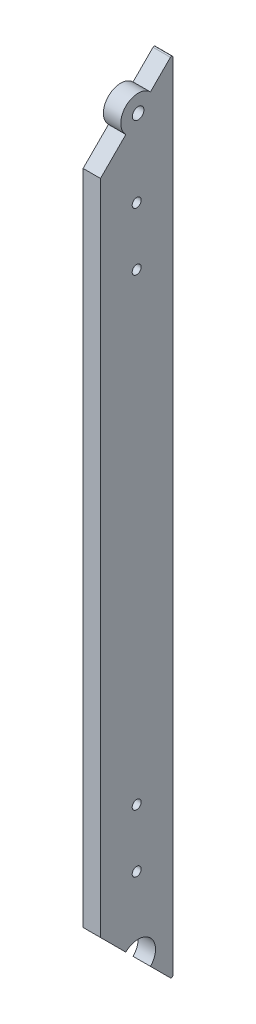
ISO-10303-21;
HEADER;
FILE_DESCRIPTION(('STEP AP214'),'2;1');
FILE_NAME('part.step','',(''),(''),'','','');
FILE_SCHEMA(('AUTOMOTIVE_DESIGN { 1 0 10303 214 1 1 1 1 }'));
ENDSEC;
DATA;
#1=APPLICATION_CONTEXT('core data for automotive mechanical design processes');
#2=APPLICATION_PROTOCOL_DEFINITION('international standard','automotive_design',2000,#1);
#3=PRODUCT_CONTEXT('',#1,'mechanical');
#4=PRODUCT('Part','Part','',(#3));
#5=PRODUCT_RELATED_PRODUCT_CATEGORY('part','',(#4));
#6=PRODUCT_DEFINITION_FORMATION('','',#4);
#7=PRODUCT_DEFINITION_CONTEXT('part definition',#1,'design');
#8=PRODUCT_DEFINITION('design','',#6,#7);
#9=PRODUCT_DEFINITION_SHAPE('','',#8);
#10=(LENGTH_UNIT() NAMED_UNIT(*) SI_UNIT(.MILLI.,.METRE.));
#11=(NAMED_UNIT(*) PLANE_ANGLE_UNIT() SI_UNIT($,.RADIAN.));
#12=(NAMED_UNIT(*) SI_UNIT($,.STERADIAN.) SOLID_ANGLE_UNIT());
#13=UNCERTAINTY_MEASURE_WITH_UNIT(LENGTH_MEASURE(1.E-05),#10,'distance_accuracy_value','');
#14=(GEOMETRIC_REPRESENTATION_CONTEXT(3) GLOBAL_UNCERTAINTY_ASSIGNED_CONTEXT((#13)) GLOBAL_UNIT_ASSIGNED_CONTEXT((#10,
#11,#12)) REPRESENTATION_CONTEXT('',''));
#15=CARTESIAN_POINT('',(0.,0.,0.));
#16=DIRECTION('',(0.,0.,1.));
#17=DIRECTION('',(1.,0.,0.));
#18=AXIS2_PLACEMENT_3D('',#15,#16,#17);
#19=CARTESIAN_POINT('',(6.,30.6749264298105,30.6749264298105));
#20=DIRECTION('',(0.,0.707106781186549,-0.707106781186546));
#21=DIRECTION('',(0.,0.707106781186546,0.707106781186549));
#22=AXIS2_PLACEMENT_3D('',#19,#20,#21);
#23=PLANE('',#22);
#24=DIRECTION('',(0.,-0.707106781186546,-0.707106781186549));
#25=VECTOR('',#24,1.);
#26=CARTESIAN_POINT('',(0.,30.6749264298105,30.6749264298105));
#27=LINE('',#26,#25);
#28=CARTESIAN_POINT('',(0.,30.6749264298105,30.6749264298105));
#29=VERTEX_POINT('',#28);
#30=CARTESIAN_POINT('',(0.,21.9175671169298,21.9175671169298));
#31=VERTEX_POINT('',#30);
#32=EDGE_CURVE('E136',#29,#31,#27,.T.);
#33=ORIENTED_EDGE('',*,*,#32,.T.);
#34=DIRECTION('',(1.,0.,0.));
#35=VECTOR('',#34,1.);
#36=CARTESIAN_POINT('',(0.,21.9175671169298,21.9175671169298));
#37=LINE('',#36,#35);
#38=CARTESIAN_POINT('',(6.,21.9175671169298,21.9175671169298));
#39=VERTEX_POINT('',#38);
#40=EDGE_CURVE('E60',#31,#39,#37,.T.);
#41=ORIENTED_EDGE('',*,*,#40,.T.);
#42=DIRECTION('',(0.,-0.707106781186546,-0.707106781186549));
#43=VECTOR('',#42,1.);
#44=CARTESIAN_POINT('',(6.,30.6749264298105,30.6749264298105));
#45=LINE('',#44,#43);
#46=CARTESIAN_POINT('',(6.,30.6749264298105,30.6749264298105));
#47=VERTEX_POINT('',#46);
#48=EDGE_CURVE('E196',#47,#39,#45,.T.);
#49=ORIENTED_EDGE('',*,*,#48,.F.);
#50=DIRECTION('',(-1.,0.,0.));
#51=VECTOR('',#50,1.);
#52=CARTESIAN_POINT('',(6.,30.6749264298105,30.6749264298105));
#53=LINE('',#52,#51);
#54=EDGE_CURVE('E152',#47,#29,#53,.T.);
#55=ORIENTED_EDGE('',*,*,#54,.T.);
#56=EDGE_LOOP('',(#33,#41,#49,#55));
#57=FACE_BOUND('',#56,.T.);
#58=ADVANCED_FACE('F45',(#57),#23,.F.);
#59=CARTESIAN_POINT('',(6.,257.67492642981,30.6749264298105));
#60=DIRECTION('',(0.,-0.707106781186543,-0.707106781186552));
#61=DIRECTION('',(0.,0.707106781186552,-0.707106781186543));
#62=AXIS2_PLACEMENT_3D('',#59,#60,#61);
#63=PLANE('',#62);
#64=DIRECTION('',(0.,-0.707106781186552,0.707106781186543));
#65=VECTOR('',#64,1.);
#66=CARTESIAN_POINT('',(0.,257.67492642981,30.6749264298105));
#67=LINE('',#66,#65);
#68=CARTESIAN_POINT('',(0.,281.821373039217,6.52847982040379));
#69=VERTEX_POINT('',#68);
#70=CARTESIAN_POINT('',(0.,274.91756711693,13.4322857426912));
#71=VERTEX_POINT('',#70);
#72=EDGE_CURVE('E146',#69,#71,#67,.T.);
#73=ORIENTED_EDGE('',*,*,#72,.T.);
#74=DIRECTION('',(1.,0.,0.));
#75=VECTOR('',#74,1.);
#76=CARTESIAN_POINT('',(-16.9705627484771,274.91756711693,13.4322857426912));
#77=LINE('',#76,#75);
#78=CARTESIAN_POINT('',(6.,274.91756711693,13.4322857426912));
#79=VERTEX_POINT('',#78);
#80=EDGE_CURVE('E140',#71,#79,#77,.T.);
#81=ORIENTED_EDGE('',*,*,#80,.T.);
#82=DIRECTION('',(0.,-0.707106781186552,0.707106781186543));
#83=VECTOR('',#82,1.);
#84=CARTESIAN_POINT('',(6.,257.67492642981,30.6749264298105));
#85=LINE('',#84,#83);
#86=CARTESIAN_POINT('',(6.,281.821373039217,6.52847982040379));
#87=VERTEX_POINT('',#86);
#88=EDGE_CURVE('E183',#87,#79,#85,.T.);
#89=ORIENTED_EDGE('',*,*,#88,.F.);
#90=DIRECTION('',(-1.,0.,0.));
#91=VECTOR('',#90,1.);
#92=CARTESIAN_POINT('',(6.,281.821373039217,6.52847982040379));
#93=LINE('',#92,#91);
#94=EDGE_CURVE('E49',#87,#69,#93,.T.);
#95=ORIENTED_EDGE('',*,*,#94,.T.);
#96=EDGE_LOOP('',(#73,#81,#89,#95));
#97=FACE_BOUND('',#96,.T.);
#98=ADVANCED_FACE('F178',(#97),#63,.F.);
#99=CARTESIAN_POINT('',(6.,13.4322857426912,13.4322857426912));
#100=VERTEX_POINT('',#99);
#101=CARTESIAN_POINT('',(6.,6.5284798204038,6.52847982040374));
#102=VERTEX_POINT('',#101);
#103=EDGE_CURVE('E129',#100,#102,#45,.T.);
#104=ORIENTED_EDGE('',*,*,#103,.F.);
#105=DIRECTION('',(1.,0.,0.));
#106=VECTOR('',#105,1.);
#107=CARTESIAN_POINT('',(0.,13.4322857426912,13.4322857426912));
#108=LINE('',#107,#106);
#109=CARTESIAN_POINT('',(0.,13.4322857426912,13.4322857426912));
#110=VERTEX_POINT('',#109);
#111=EDGE_CURVE('E118',#100,#110,#108,.F.);
#112=ORIENTED_EDGE('',*,*,#111,.T.);
#113=CARTESIAN_POINT('',(0.,6.5284798204038,6.52847982040374));
#114=VERTEX_POINT('',#113);
#115=EDGE_CURVE('E127',#110,#114,#27,.T.);
#116=ORIENTED_EDGE('',*,*,#115,.T.);
#117=DIRECTION('',(-1.,0.,0.));
#118=VECTOR('',#117,1.);
#119=CARTESIAN_POINT('',(6.,6.52847982040379,6.52847982040374));
#120=LINE('',#119,#118);
#121=EDGE_CURVE('E170',#114,#102,#120,.F.);
#122=ORIENTED_EDGE('',*,*,#121,.T.);
#123=EDGE_LOOP('',(#104,#112,#116,#122));
#124=FACE_BOUND('',#123,.T.);
#125=ADVANCED_FACE('F126',(#124),#23,.F.);
#126=CARTESIAN_POINT('',(6.,282.674926429811,5.67492642981051));
#127=DIRECTION('',(0.,0.,1.));
#128=DIRECTION('',(0.,-1.,0.));
#129=AXIS2_PLACEMENT_3D('',#126,#127,#128);
#130=PLANE('',#129);
#131=DIRECTION('',(0.,1.,0.));
#132=VECTOR('',#131,1.);
#133=CARTESIAN_POINT('',(6.,282.674926429811,5.67492642981051));
#134=LINE('',#133,#132);
#135=CARTESIAN_POINT('',(6.,6.88203321099706,5.67492642981048));
#136=VERTEX_POINT('',#135);
#137=CARTESIAN_POINT('',(6.,281.467819648624,5.67492642981051));
#138=VERTEX_POINT('',#137);
#139=EDGE_CURVE('E197',#136,#138,#134,.T.);
#140=ORIENTED_EDGE('',*,*,#139,.F.);
#141=DIRECTION('',(-1.,0.,0.));
#142=VECTOR('',#141,1.);
#143=CARTESIAN_POINT('',(6.,6.88203321099706,5.67492642981048));
#144=LINE('',#143,#142);
#145=CARTESIAN_POINT('',(0.,6.88203321099706,5.67492642981048));
#146=VERTEX_POINT('',#145);
#147=EDGE_CURVE('E161',#136,#146,#144,.T.);
#148=ORIENTED_EDGE('',*,*,#147,.T.);
#149=DIRECTION('',(0.,1.,0.));
#150=VECTOR('',#149,1.);
#151=CARTESIAN_POINT('',(0.,282.674926429811,5.67492642981051));
#152=LINE('',#151,#150);
#153=CARTESIAN_POINT('',(0.,281.467819648624,5.67492642981051));
#154=VERTEX_POINT('',#153);
#155=EDGE_CURVE('E137',#146,#154,#152,.T.);
#156=ORIENTED_EDGE('',*,*,#155,.T.);
#157=DIRECTION('',(-1.,0.,0.));
#158=VECTOR('',#157,1.);
#159=CARTESIAN_POINT('',(6.,281.467819648624,5.67492642981051));
#160=LINE('',#159,#158);
#161=EDGE_CURVE('E158',#154,#138,#160,.F.);
#162=ORIENTED_EDGE('',*,*,#161,.T.);
#163=EDGE_LOOP('',(#140,#148,#156,#162));
#164=FACE_BOUND('',#163,.T.);
#165=ADVANCED_FACE('F282',(#164),#130,.F.);
#166=CARTESIAN_POINT('',(6.,266.432285742691,21.9175671169297));
#167=VERTEX_POINT('',#166);
#168=CARTESIAN_POINT('',(6.,257.67492642981,30.6749264298105));
#169=VERTEX_POINT('',#168);
#170=EDGE_CURVE('E63',#167,#169,#85,.T.);
#171=ORIENTED_EDGE('',*,*,#170,.F.);
#172=DIRECTION('',(1.,0.,0.));
#173=VECTOR('',#172,1.);
#174=CARTESIAN_POINT('',(-16.9705627484771,266.432285742691,21.9175671169297));
#175=LINE('',#174,#173);
#176=CARTESIAN_POINT('',(0.,266.432285742691,21.9175671169297));
#177=VERTEX_POINT('',#176);
#178=EDGE_CURVE('E144',#167,#177,#175,.F.);
#179=ORIENTED_EDGE('',*,*,#178,.T.);
#180=CARTESIAN_POINT('',(0.,257.67492642981,30.6749264298105));
#181=VERTEX_POINT('',#180);
#182=EDGE_CURVE('E149',#177,#181,#67,.T.);
#183=ORIENTED_EDGE('',*,*,#182,.T.);
#184=DIRECTION('',(-1.,0.,0.));
#185=VECTOR('',#184,1.);
#186=CARTESIAN_POINT('',(6.,257.67492642981,30.6749264298105));
#187=LINE('',#186,#185);
#188=EDGE_CURVE('E160',#169,#181,#187,.T.);
#189=ORIENTED_EDGE('',*,*,#188,.F.);
#190=EDGE_LOOP('',(#171,#179,#183,#189));
#191=FACE_BOUND('',#190,.T.);
#192=ADVANCED_FACE('F207',(#191),#63,.F.);
#193=CARTESIAN_POINT('',(6.,30.6749264298105,30.6749264298105));
#194=DIRECTION('',(0.,0.,-1.));
#195=DIRECTION('',(-1.,0.,0.));
#196=AXIS2_PLACEMENT_3D('',#193,#194,#195);
#197=PLANE('',#196);
#198=DIRECTION('',(0.,-1.,0.));
#199=VECTOR('',#198,1.);
#200=CARTESIAN_POINT('',(0.,30.6749264298105,30.6749264298105));
#201=LINE('',#200,#199);
#202=EDGE_CURVE('E155',#181,#29,#201,.T.);
#203=ORIENTED_EDGE('',*,*,#202,.T.);
#204=ORIENTED_EDGE('',*,*,#54,.F.);
#205=DIRECTION('',(0.,-1.,0.));
#206=VECTOR('',#205,1.);
#207=CARTESIAN_POINT('',(6.,30.6749264298105,30.6749264298105));
#208=LINE('',#207,#206);
#209=EDGE_CURVE('E142',#169,#47,#208,.T.);
#210=ORIENTED_EDGE('',*,*,#209,.F.);
#211=ORIENTED_EDGE('',*,*,#188,.T.);
#212=EDGE_LOOP('',(#203,#204,#210,#211));
#213=FACE_BOUND('',#212,.T.);
#214=ADVANCED_FACE('F209',(#213),#197,.F.);
#215=CARTESIAN_POINT('',(6.,0.,0.));
#216=DIRECTION('',(1.,0.,0.));
#217=DIRECTION('',(0.,0.,-1.));
#218=AXIS2_PLACEMENT_3D('',#215,#216,#217);
#219=PLANE('',#218);
#220=CARTESIAN_POINT('',(6.,244.17492642981,18.1749264298105));
#221=DIRECTION('',(1.,0.,0.));
#222=DIRECTION('',(0.,0.,-1.));
#223=AXIS2_PLACEMENT_3D('',#220,#221,#222);
#224=CIRCLE('',#223,1.55);
#225=CARTESIAN_POINT('',(6.,244.17492642981,16.6249264298105));
#226=VERTEX_POINT('',#225);
#227=EDGE_CURVE('E220',#226,#226,#224,.T.);
#228=ORIENTED_EDGE('',*,*,#227,.F.);
#229=EDGE_LOOP('',(#228));
#230=FACE_BOUND('',#229,.T.);
#231=CARTESIAN_POINT('',(6.,224.17492642981,18.1749264298105));
#232=DIRECTION('',(1.,0.,0.));
#233=DIRECTION('',(0.,0.,-1.));
#234=AXIS2_PLACEMENT_3D('',#231,#232,#233);
#235=CIRCLE('',#234,1.55);
#236=CARTESIAN_POINT('',(6.,224.17492642981,16.6249264298105));
#237=VERTEX_POINT('',#236);
#238=EDGE_CURVE('E239',#237,#237,#235,.T.);
#239=ORIENTED_EDGE('',*,*,#238,.F.);
#240=EDGE_LOOP('',(#239));
#241=FACE_BOUND('',#240,.T.);
#242=CARTESIAN_POINT('',(6.,64.1749264298103,18.1749264298105));
#243=DIRECTION('',(1.,0.,0.));
#244=DIRECTION('',(0.,0.,1.));
#245=AXIS2_PLACEMENT_3D('',#242,#243,#244);
#246=CIRCLE('',#245,1.55);
#247=CARTESIAN_POINT('',(6.,64.1749264298103,16.6249264298105));
#248=VERTEX_POINT('',#247);
#249=EDGE_CURVE('E229',#248,#248,#246,.T.);
#250=ORIENTED_EDGE('',*,*,#249,.F.);
#251=EDGE_LOOP('',(#250));
#252=FACE_BOUND('',#251,.T.);
#253=CARTESIAN_POINT('',(6.,44.1749264298104,18.1749264298105));
#254=DIRECTION('',(1.,0.,0.));
#255=DIRECTION('',(0.,0.,1.));
#256=AXIS2_PLACEMENT_3D('',#253,#254,#255);
#257=CIRCLE('',#256,1.55);
#258=CARTESIAN_POINT('',(6.,44.1749264298104,16.6249264298105));
#259=VERTEX_POINT('',#258);
#260=EDGE_CURVE('E223',#259,#259,#257,.T.);
#261=ORIENTED_EDGE('',*,*,#260,.F.);
#262=EDGE_LOOP('',(#261));
#263=FACE_BOUND('',#262,.T.);
#264=CARTESIAN_POINT('',(6.,270.67492642981,17.6749264298102));
#265=DIRECTION('',(1.,0.,0.));
#266=DIRECTION('',(0.,0.,-1.));
#267=AXIS2_PLACEMENT_3D('',#264,#265,#266);
#268=CIRCLE('',#267,2.);
#269=CARTESIAN_POINT('',(6.,270.67492642981,15.6749264298102));
#270=VERTEX_POINT('',#269);
#271=EDGE_CURVE('E211',#270,#270,#268,.T.);
#272=ORIENTED_EDGE('',*,*,#271,.F.);
#273=EDGE_LOOP('',(#272));
#274=FACE_BOUND('',#273,.T.);
#275=CARTESIAN_POINT('',(6.,17.6749264298105,17.6749264298105));
#276=DIRECTION('',(1.,0.,0.));
#277=DIRECTION('',(0.,0.,-1.));
#278=AXIS2_PLACEMENT_3D('',#275,#276,#277);
#279=CIRCLE('',#278,6.);
#280=EDGE_CURVE('E214',#100,#39,#279,.T.);
#281=ORIENTED_EDGE('',*,*,#280,.F.);
#282=ORIENTED_EDGE('',*,*,#103,.T.);
#283=CARTESIAN_POINT('',(6.,6.88203321099706,6.17492642981048));
#284=DIRECTION('',(1.,0.,0.));
#285=DIRECTION('',(0.,0.,-1.));
#286=AXIS2_PLACEMENT_3D('',#283,#284,#285);
#287=CIRCLE('',#286,0.5);
#288=EDGE_CURVE('E175',#102,#136,#287,.T.);
#289=ORIENTED_EDGE('',*,*,#288,.T.);
#290=ORIENTED_EDGE('',*,*,#139,.T.);
#291=CARTESIAN_POINT('',(6.,281.467819648624,6.17492642981051));
#292=DIRECTION('',(1.,0.,0.));
#293=DIRECTION('',(0.,0.,-1.));
#294=AXIS2_PLACEMENT_3D('',#291,#292,#293);
#295=CIRCLE('',#294,0.5);
#296=EDGE_CURVE('E167',#138,#87,#295,.T.);
#297=ORIENTED_EDGE('',*,*,#296,.T.);
#298=ORIENTED_EDGE('',*,*,#88,.T.);
#299=CARTESIAN_POINT('',(6.,270.67492642981,17.6749264298102));
#300=DIRECTION('',(1.,0.,0.));
#301=DIRECTION('',(0.,0.,-1.));
#302=AXIS2_PLACEMENT_3D('',#299,#300,#301);
#303=CIRCLE('',#302,6.);
#304=EDGE_CURVE('E189',#79,#167,#303,.T.);
#305=ORIENTED_EDGE('',*,*,#304,.T.);
#306=ORIENTED_EDGE('',*,*,#170,.T.);
#307=ORIENTED_EDGE('',*,*,#209,.T.);
#308=ORIENTED_EDGE('',*,*,#48,.T.);
#309=EDGE_LOOP('',(#281,#282,#289,#290,#297,#298,#305,#306,#307,#308));
#310=FACE_BOUND('',#309,.T.);
#311=ADVANCED_FACE('F202',(#230,#241,#252,#263,#274,#310),#219,.T.);
#312=CARTESIAN_POINT('',(0.,0.,0.));
#313=DIRECTION('',(1.,0.,0.));
#314=DIRECTION('',(0.,0.,-1.));
#315=AXIS2_PLACEMENT_3D('',#312,#313,#314);
#316=PLANE('',#315);
#317=CARTESIAN_POINT('',(0.,244.17492642981,18.1749264298105));
#318=DIRECTION('',(1.,0.,0.));
#319=DIRECTION('',(0.,0.,-1.));
#320=AXIS2_PLACEMENT_3D('',#317,#318,#319);
#321=CIRCLE('',#320,1.55);
#322=CARTESIAN_POINT('',(0.,244.17492642981,16.6249264298105));
#323=VERTEX_POINT('',#322);
#324=EDGE_CURVE('E215',#323,#323,#321,.F.);
#325=ORIENTED_EDGE('',*,*,#324,.F.);
#326=EDGE_LOOP('',(#325));
#327=FACE_BOUND('',#326,.T.);
#328=CARTESIAN_POINT('',(0.,224.17492642981,18.1749264298105));
#329=DIRECTION('',(1.,0.,0.));
#330=DIRECTION('',(0.,0.,-1.));
#331=AXIS2_PLACEMENT_3D('',#328,#329,#330);
#332=CIRCLE('',#331,1.55);
#333=CARTESIAN_POINT('',(0.,224.17492642981,16.6249264298105));
#334=VERTEX_POINT('',#333);
#335=EDGE_CURVE('E231',#334,#334,#332,.F.);
#336=ORIENTED_EDGE('',*,*,#335,.F.);
#337=EDGE_LOOP('',(#336));
#338=FACE_BOUND('',#337,.T.);
#339=CARTESIAN_POINT('',(0.,64.1749264298103,18.1749264298105));
#340=DIRECTION('',(1.,0.,0.));
#341=DIRECTION('',(0.,0.,-1.));
#342=AXIS2_PLACEMENT_3D('',#339,#340,#341);
#343=CIRCLE('',#342,1.55);
#344=CARTESIAN_POINT('',(0.,64.1749264298103,16.6249264298105));
#345=VERTEX_POINT('',#344);
#346=EDGE_CURVE('E226',#345,#345,#343,.F.);
#347=ORIENTED_EDGE('',*,*,#346,.F.);
#348=EDGE_LOOP('',(#347));
#349=FACE_BOUND('',#348,.T.);
#350=CARTESIAN_POINT('',(0.,44.1749264298104,18.1749264298105));
#351=DIRECTION('',(1.,0.,0.));
#352=DIRECTION('',(0.,0.,-1.));
#353=AXIS2_PLACEMENT_3D('',#350,#351,#352);
#354=CIRCLE('',#353,1.55);
#355=CARTESIAN_POINT('',(0.,44.1749264298104,16.6249264298105));
#356=VERTEX_POINT('',#355);
#357=EDGE_CURVE('E230',#356,#356,#354,.F.);
#358=ORIENTED_EDGE('',*,*,#357,.F.);
#359=EDGE_LOOP('',(#358));
#360=FACE_BOUND('',#359,.T.);
#361=CARTESIAN_POINT('',(0.,270.67492642981,17.6749264298102));
#362=DIRECTION('',(1.,0.,0.));
#363=DIRECTION('',(0.,0.,-1.));
#364=AXIS2_PLACEMENT_3D('',#361,#362,#363);
#365=CIRCLE('',#364,2.);
#366=CARTESIAN_POINT('',(0.,270.67492642981,15.6749264298102));
#367=VERTEX_POINT('',#366);
#368=EDGE_CURVE('E132',#367,#367,#365,.T.);
#369=ORIENTED_EDGE('',*,*,#368,.T.);
#370=EDGE_LOOP('',(#369));
#371=FACE_BOUND('',#370,.T.);
#372=ORIENTED_EDGE('',*,*,#115,.F.);
#373=CARTESIAN_POINT('',(0.,17.6749264298105,17.6749264298105));
#374=DIRECTION('',(1.,0.,0.));
#375=DIRECTION('',(0.,0.,-1.));
#376=AXIS2_PLACEMENT_3D('',#373,#374,#375);
#377=CIRCLE('',#376,6.);
#378=EDGE_CURVE('E12',#110,#31,#377,.T.);
#379=ORIENTED_EDGE('',*,*,#378,.T.);
#380=ORIENTED_EDGE('',*,*,#32,.F.);
#381=ORIENTED_EDGE('',*,*,#202,.F.);
#382=ORIENTED_EDGE('',*,*,#182,.F.);
#383=CARTESIAN_POINT('',(0.,270.67492642981,17.6749264298102));
#384=DIRECTION('',(1.,0.,0.));
#385=DIRECTION('',(0.,0.,-1.));
#386=AXIS2_PLACEMENT_3D('',#383,#384,#385);
#387=CIRCLE('',#386,6.);
#388=EDGE_CURVE('E188',#177,#71,#387,.F.);
#389=ORIENTED_EDGE('',*,*,#388,.T.);
#390=ORIENTED_EDGE('',*,*,#72,.F.);
#391=CARTESIAN_POINT('',(0.,281.467819648624,6.17492642981051));
#392=DIRECTION('',(1.,0.,0.));
#393=DIRECTION('',(0.,0.,-1.));
#394=AXIS2_PLACEMENT_3D('',#391,#392,#393);
#395=CIRCLE('',#394,0.5);
#396=EDGE_CURVE('E162',#69,#154,#395,.F.);
#397=ORIENTED_EDGE('',*,*,#396,.T.);
#398=ORIENTED_EDGE('',*,*,#155,.F.);
#399=CARTESIAN_POINT('',(0.,6.88203321099706,6.17492642981048));
#400=DIRECTION('',(1.,0.,0.));
#401=DIRECTION('',(0.,0.,-1.));
#402=AXIS2_PLACEMENT_3D('',#399,#400,#401);
#403=CIRCLE('',#402,0.5);
#404=EDGE_CURVE('E133',#146,#114,#403,.F.);
#405=ORIENTED_EDGE('',*,*,#404,.T.);
#406=EDGE_LOOP('',(#372,#379,#380,#381,#382,#389,#390,#397,#398,#405));
#407=FACE_BOUND('',#406,.T.);
#408=ADVANCED_FACE('F134',(#327,#338,#349,#360,#371,#407),#316,.F.);
#409=CARTESIAN_POINT('',(6.,6.88203321099706,6.17492642981048));
#410=DIRECTION('',(-1.,0.,0.));
#411=DIRECTION('',(0.,0.,1.));
#412=AXIS2_PLACEMENT_3D('',#409,#410,#411);
#413=CYLINDRICAL_SURFACE('',#412,0.5);
#414=ORIENTED_EDGE('',*,*,#288,.F.);
#415=ORIENTED_EDGE('',*,*,#121,.F.);
#416=ORIENTED_EDGE('',*,*,#404,.F.);
#417=ORIENTED_EDGE('',*,*,#147,.F.);
#418=EDGE_LOOP('',(#414,#415,#416,#417));
#419=FACE_BOUND('',#418,.T.);
#420=ADVANCED_FACE('F293',(#419),#413,.T.);
#421=CARTESIAN_POINT('',(6.,281.467819648624,6.17492642981051));
#422=DIRECTION('',(-1.,0.,0.));
#423=DIRECTION('',(0.,0.,1.));
#424=AXIS2_PLACEMENT_3D('',#421,#422,#423);
#425=CYLINDRICAL_SURFACE('',#424,0.5);
#426=ORIENTED_EDGE('',*,*,#296,.F.);
#427=ORIENTED_EDGE('',*,*,#161,.F.);
#428=ORIENTED_EDGE('',*,*,#396,.F.);
#429=ORIENTED_EDGE('',*,*,#94,.F.);
#430=EDGE_LOOP('',(#426,#427,#428,#429));
#431=FACE_BOUND('',#430,.T.);
#432=ADVANCED_FACE('F42',(#431),#425,.T.);
#433=CARTESIAN_POINT('',(-16.9705627484771,270.67492642981,17.6749264298102));
#434=DIRECTION('',(1.,0.,0.));
#435=DIRECTION('',(0.,0.,-1.));
#436=AXIS2_PLACEMENT_3D('',#433,#434,#435);
#437=CYLINDRICAL_SURFACE('',#436,6.);
#438=ORIENTED_EDGE('',*,*,#80,.F.);
#439=ORIENTED_EDGE('',*,*,#388,.F.);
#440=ORIENTED_EDGE('',*,*,#178,.F.);
#441=ORIENTED_EDGE('',*,*,#304,.F.);
#442=EDGE_LOOP('',(#438,#439,#440,#441));
#443=FACE_BOUND('',#442,.T.);
#444=ADVANCED_FACE('F269',(#443),#437,.T.);
#445=CARTESIAN_POINT('',(0.,17.6749264298105,17.6749264298105));
#446=DIRECTION('',(1.,0.,0.));
#447=DIRECTION('',(0.,0.,-1.));
#448=AXIS2_PLACEMENT_3D('',#445,#446,#447);
#449=CYLINDRICAL_SURFACE('',#448,6.);
#450=ORIENTED_EDGE('',*,*,#378,.F.);
#451=ORIENTED_EDGE('',*,*,#111,.F.);
#452=ORIENTED_EDGE('',*,*,#280,.T.);
#453=ORIENTED_EDGE('',*,*,#40,.F.);
#454=EDGE_LOOP('',(#450,#451,#452,#453));
#455=FACE_BOUND('',#454,.T.);
#456=ADVANCED_FACE('F120',(#455),#449,.F.);
#457=CARTESIAN_POINT('',(0.,270.67492642981,17.6749264298102));
#458=DIRECTION('',(1.,0.,0.));
#459=DIRECTION('',(0.,0.,-1.));
#460=AXIS2_PLACEMENT_3D('',#457,#458,#459);
#461=CYLINDRICAL_SURFACE('',#460,2.);
#462=ORIENTED_EDGE('',*,*,#368,.F.);
#463=EDGE_LOOP('',(#462));
#464=FACE_BOUND('',#463,.T.);
#465=ORIENTED_EDGE('',*,*,#271,.T.);
#466=EDGE_LOOP('',(#465));
#467=FACE_BOUND('',#466,.T.);
#468=ADVANCED_FACE('F256',(#464,#467),#461,.F.);
#469=CARTESIAN_POINT('',(-0.00100000000000013,44.1749264298104,18.1749264298105));
#470=DIRECTION('',(1.,0.,0.));
#471=DIRECTION('',(0.,0.,-1.));
#472=AXIS2_PLACEMENT_3D('',#469,#470,#471);
#473=CYLINDRICAL_SURFACE('',#472,1.55);
#474=CARTESIAN_POINT('',(6.,44.1749264298104,16.6249264298105));
#475=CARTESIAN_POINT('',(5.9375,44.1749264298104,16.6249264298105));
#476=CARTESIAN_POINT('',(5.875,44.1749264298104,16.6249264298105));
#477=CARTESIAN_POINT('',(5.75,44.1749264298104,16.6249264298105));
#478=CARTESIAN_POINT('',(5.6875,44.1749264298104,16.6249264298105));
#479=CARTESIAN_POINT('',(5.5625,44.1749264298104,16.6249264298105));
#480=CARTESIAN_POINT('',(5.5,44.1749264298104,16.6249264298105));
#481=CARTESIAN_POINT('',(5.375,44.1749264298104,16.6249264298105));
#482=CARTESIAN_POINT('',(5.3125,44.1749264298104,16.6249264298105));
#483=CARTESIAN_POINT('',(5.1875,44.1749264298104,16.6249264298105));
#484=CARTESIAN_POINT('',(5.125,44.1749264298104,16.6249264298105));
#485=CARTESIAN_POINT('',(5.,44.1749264298104,16.6249264298105));
#486=CARTESIAN_POINT('',(4.9375,44.1749264298104,16.6249264298105));
#487=CARTESIAN_POINT('',(4.8125,44.1749264298104,16.6249264298105));
#488=CARTESIAN_POINT('',(4.75,44.1749264298104,16.6249264298105));
#489=CARTESIAN_POINT('',(4.625,44.1749264298104,16.6249264298105));
#490=CARTESIAN_POINT('',(4.5625,44.1749264298104,16.6249264298105));
#491=CARTESIAN_POINT('',(4.4375,44.1749264298104,16.6249264298105));
#492=CARTESIAN_POINT('',(4.375,44.1749264298104,16.6249264298105));
#493=CARTESIAN_POINT('',(4.25,44.1749264298104,16.6249264298105));
#494=CARTESIAN_POINT('',(4.1875,44.1749264298104,16.6249264298105));
#495=CARTESIAN_POINT('',(4.0625,44.1749264298104,16.6249264298105));
#496=CARTESIAN_POINT('',(4.,44.1749264298104,16.6249264298105));
#497=CARTESIAN_POINT('',(3.875,44.1749264298104,16.6249264298105));
#498=CARTESIAN_POINT('',(3.8125,44.1749264298104,16.6249264298105));
#499=CARTESIAN_POINT('',(3.6875,44.1749264298104,16.6249264298105));
#500=CARTESIAN_POINT('',(3.625,44.1749264298104,16.6249264298105));
#501=CARTESIAN_POINT('',(3.5,44.1749264298104,16.6249264298105));
#502=CARTESIAN_POINT('',(3.4375,44.1749264298104,16.6249264298105));
#503=CARTESIAN_POINT('',(3.3125,44.1749264298104,16.6249264298105));
#504=CARTESIAN_POINT('',(3.25,44.1749264298104,16.6249264298105));
#505=CARTESIAN_POINT('',(3.125,44.1749264298104,16.6249264298105));
#506=CARTESIAN_POINT('',(3.0625,44.1749264298104,16.6249264298105));
#507=CARTESIAN_POINT('',(2.9375,44.1749264298104,16.6249264298105));
#508=CARTESIAN_POINT('',(2.875,44.1749264298104,16.6249264298105));
#509=CARTESIAN_POINT('',(2.75,44.1749264298104,16.6249264298105));
#510=CARTESIAN_POINT('',(2.6875,44.1749264298104,16.6249264298105));
#511=CARTESIAN_POINT('',(2.5625,44.1749264298104,16.6249264298105));
#512=CARTESIAN_POINT('',(2.5,44.1749264298104,16.6249264298105));
#513=CARTESIAN_POINT('',(2.375,44.1749264298104,16.6249264298105));
#514=CARTESIAN_POINT('',(2.3125,44.1749264298104,16.6249264298105));
#515=CARTESIAN_POINT('',(2.1875,44.1749264298104,16.6249264298105));
#516=CARTESIAN_POINT('',(2.125,44.1749264298104,16.6249264298105));
#517=CARTESIAN_POINT('',(2.,44.1749264298104,16.6249264298105));
#518=CARTESIAN_POINT('',(1.9375,44.1749264298104,16.6249264298105));
#519=CARTESIAN_POINT('',(1.8125,44.1749264298104,16.6249264298105));
#520=CARTESIAN_POINT('',(1.75,44.1749264298104,16.6249264298105));
#521=CARTESIAN_POINT('',(1.625,44.1749264298104,16.6249264298105));
#522=CARTESIAN_POINT('',(1.5625,44.1749264298104,16.6249264298105));
#523=CARTESIAN_POINT('',(1.4375,44.1749264298104,16.6249264298105));
#524=CARTESIAN_POINT('',(1.375,44.1749264298104,16.6249264298105));
#525=CARTESIAN_POINT('',(1.25,44.1749264298104,16.6249264298105));
#526=CARTESIAN_POINT('',(1.1875,44.1749264298104,16.6249264298105));
#527=CARTESIAN_POINT('',(1.0625,44.1749264298104,16.6249264298105));
#528=CARTESIAN_POINT('',(1.,44.1749264298104,16.6249264298105));
#529=CARTESIAN_POINT('',(0.875,44.1749264298104,16.6249264298105));
#530=CARTESIAN_POINT('',(0.8125,44.1749264298104,16.6249264298105));
#531=CARTESIAN_POINT('',(0.6875,44.1749264298104,16.6249264298105));
#532=CARTESIAN_POINT('',(0.625,44.1749264298104,16.6249264298105));
#533=CARTESIAN_POINT('',(0.5,44.1749264298104,16.6249264298105));
#534=CARTESIAN_POINT('',(0.4375,44.1749264298104,16.6249264298105));
#535=CARTESIAN_POINT('',(0.3125,44.1749264298104,16.6249264298105));
#536=CARTESIAN_POINT('',(0.25,44.1749264298104,16.6249264298105));
#537=CARTESIAN_POINT('',(0.125,44.1749264298104,16.6249264298105));
#538=CARTESIAN_POINT('',(0.0625000000000001,44.1749264298104,16.6249264298105));
#539=CARTESIAN_POINT('',(0.,44.1749264298104,16.6249264298105));
#540=B_SPLINE_CURVE_WITH_KNOTS('',3,(#474,#475,#476,#477,#478,#479,#480,#481,#482,#483,#484,
#485,#486,#487,#488,#489,#490,#491,#492,#493,#494,#495,#496,#497,#498,#499,#500,#501,#502,#503,
#504,#505,#506,#507,#508,#509,#510,#511,#512,#513,#514,#515,#516,#517,#518,#519,#520,#521,#522,
#523,#524,#525,#526,#527,#528,#529,#530,#531,#532,#533,#534,#535,#536,#537,#538,#539),
.UNSPECIFIED.,.F.,.F.,(4,2,2,2,2,2,2,2,2,2,2,2,2,2,2,2,2,2,2,2,2,2,2,2,2,2,2,2,2,2,2,2,4),(0.,
0.1875,0.375,0.5625,0.75,0.9375,1.125,1.3125,1.5,1.6875,1.875,2.0625,2.25,2.4375,2.625,2.8125,
3.,3.1875,3.375,3.5625,3.75,3.9375,4.125,4.3125,4.5,4.6875,4.875,5.0625,5.25,5.4375,5.625,
5.8125,6.),.UNSPECIFIED.);
#541=EDGE_CURVE('BSEAM259',#259,#356,#540,.T.);
#542=ORIENTED_EDGE('',*,*,#260,.T.);
#543=ORIENTED_EDGE('',*,*,#357,.T.);
#544=ORIENTED_EDGE('',*,*,#541,.T.);
#545=ORIENTED_EDGE('',*,*,#541,.F.);
#546=EDGE_LOOP('',(#542,#544,#543,#545));
#547=FACE_BOUND('',#546,.T.);
#548=ADVANCED_FACE('F259',(#547),#473,.F.);
#549=CARTESIAN_POINT('',(-0.00100000000000013,64.1749264298103,18.1749264298105));
#550=DIRECTION('',(1.,0.,0.));
#551=DIRECTION('',(0.,0.,-1.));
#552=AXIS2_PLACEMENT_3D('',#549,#550,#551);
#553=CYLINDRICAL_SURFACE('',#552,1.55);
#554=CARTESIAN_POINT('',(6.,64.1749264298103,16.6249264298105));
#555=CARTESIAN_POINT('',(5.9375,64.1749264298103,16.6249264298105));
#556=CARTESIAN_POINT('',(5.875,64.1749264298103,16.6249264298105));
#557=CARTESIAN_POINT('',(5.75,64.1749264298103,16.6249264298105));
#558=CARTESIAN_POINT('',(5.6875,64.1749264298103,16.6249264298105));
#559=CARTESIAN_POINT('',(5.5625,64.1749264298103,16.6249264298105));
#560=CARTESIAN_POINT('',(5.5,64.1749264298103,16.6249264298105));
#561=CARTESIAN_POINT('',(5.375,64.1749264298103,16.6249264298105));
#562=CARTESIAN_POINT('',(5.3125,64.1749264298103,16.6249264298105));
#563=CARTESIAN_POINT('',(5.1875,64.1749264298103,16.6249264298105));
#564=CARTESIAN_POINT('',(5.125,64.1749264298103,16.6249264298105));
#565=CARTESIAN_POINT('',(5.,64.1749264298103,16.6249264298105));
#566=CARTESIAN_POINT('',(4.9375,64.1749264298103,16.6249264298105));
#567=CARTESIAN_POINT('',(4.8125,64.1749264298103,16.6249264298105));
#568=CARTESIAN_POINT('',(4.75,64.1749264298103,16.6249264298105));
#569=CARTESIAN_POINT('',(4.625,64.1749264298103,16.6249264298105));
#570=CARTESIAN_POINT('',(4.5625,64.1749264298103,16.6249264298105));
#571=CARTESIAN_POINT('',(4.4375,64.1749264298103,16.6249264298105));
#572=CARTESIAN_POINT('',(4.375,64.1749264298103,16.6249264298105));
#573=CARTESIAN_POINT('',(4.25,64.1749264298103,16.6249264298105));
#574=CARTESIAN_POINT('',(4.1875,64.1749264298103,16.6249264298105));
#575=CARTESIAN_POINT('',(4.0625,64.1749264298103,16.6249264298105));
#576=CARTESIAN_POINT('',(4.,64.1749264298103,16.6249264298105));
#577=CARTESIAN_POINT('',(3.875,64.1749264298103,16.6249264298105));
#578=CARTESIAN_POINT('',(3.8125,64.1749264298103,16.6249264298105));
#579=CARTESIAN_POINT('',(3.6875,64.1749264298103,16.6249264298105));
#580=CARTESIAN_POINT('',(3.625,64.1749264298103,16.6249264298105));
#581=CARTESIAN_POINT('',(3.5,64.1749264298103,16.6249264298105));
#582=CARTESIAN_POINT('',(3.4375,64.1749264298103,16.6249264298105));
#583=CARTESIAN_POINT('',(3.3125,64.1749264298103,16.6249264298105));
#584=CARTESIAN_POINT('',(3.25,64.1749264298103,16.6249264298105));
#585=CARTESIAN_POINT('',(3.125,64.1749264298103,16.6249264298105));
#586=CARTESIAN_POINT('',(3.0625,64.1749264298103,16.6249264298105));
#587=CARTESIAN_POINT('',(2.9375,64.1749264298103,16.6249264298105));
#588=CARTESIAN_POINT('',(2.875,64.1749264298103,16.6249264298105));
#589=CARTESIAN_POINT('',(2.75,64.1749264298103,16.6249264298105));
#590=CARTESIAN_POINT('',(2.6875,64.1749264298103,16.6249264298105));
#591=CARTESIAN_POINT('',(2.5625,64.1749264298103,16.6249264298105));
#592=CARTESIAN_POINT('',(2.5,64.1749264298103,16.6249264298105));
#593=CARTESIAN_POINT('',(2.375,64.1749264298103,16.6249264298105));
#594=CARTESIAN_POINT('',(2.3125,64.1749264298103,16.6249264298105));
#595=CARTESIAN_POINT('',(2.1875,64.1749264298103,16.6249264298105));
#596=CARTESIAN_POINT('',(2.125,64.1749264298103,16.6249264298105));
#597=CARTESIAN_POINT('',(2.,64.1749264298103,16.6249264298105));
#598=CARTESIAN_POINT('',(1.9375,64.1749264298103,16.6249264298105));
#599=CARTESIAN_POINT('',(1.8125,64.1749264298103,16.6249264298105));
#600=CARTESIAN_POINT('',(1.75,64.1749264298103,16.6249264298105));
#601=CARTESIAN_POINT('',(1.625,64.1749264298103,16.6249264298105));
#602=CARTESIAN_POINT('',(1.5625,64.1749264298103,16.6249264298105));
#603=CARTESIAN_POINT('',(1.4375,64.1749264298103,16.6249264298105));
#604=CARTESIAN_POINT('',(1.375,64.1749264298103,16.6249264298105));
#605=CARTESIAN_POINT('',(1.25,64.1749264298103,16.6249264298105));
#606=CARTESIAN_POINT('',(1.1875,64.1749264298103,16.6249264298105));
#607=CARTESIAN_POINT('',(1.0625,64.1749264298103,16.6249264298105));
#608=CARTESIAN_POINT('',(1.,64.1749264298103,16.6249264298105));
#609=CARTESIAN_POINT('',(0.875,64.1749264298103,16.6249264298105));
#610=CARTESIAN_POINT('',(0.8125,64.1749264298103,16.6249264298105));
#611=CARTESIAN_POINT('',(0.6875,64.1749264298103,16.6249264298105));
#612=CARTESIAN_POINT('',(0.625,64.1749264298103,16.6249264298105));
#613=CARTESIAN_POINT('',(0.5,64.1749264298103,16.6249264298105));
#614=CARTESIAN_POINT('',(0.4375,64.1749264298103,16.6249264298105));
#615=CARTESIAN_POINT('',(0.3125,64.1749264298103,16.6249264298105));
#616=CARTESIAN_POINT('',(0.25,64.1749264298103,16.6249264298105));
#617=CARTESIAN_POINT('',(0.125,64.1749264298103,16.6249264298105));
#618=CARTESIAN_POINT('',(0.0625000000000001,64.1749264298103,16.6249264298105));
#619=CARTESIAN_POINT('',(0.,64.1749264298103,16.6249264298105));
#620=B_SPLINE_CURVE_WITH_KNOTS('',3,(#554,#555,#556,#557,#558,#559,#560,#561,#562,#563,#564,
#565,#566,#567,#568,#569,#570,#571,#572,#573,#574,#575,#576,#577,#578,#579,#580,#581,#582,#583,
#584,#585,#586,#587,#588,#589,#590,#591,#592,#593,#594,#595,#596,#597,#598,#599,#600,#601,#602,
#603,#604,#605,#606,#607,#608,#609,#610,#611,#612,#613,#614,#615,#616,#617,#618,#619),
.UNSPECIFIED.,.F.,.F.,(4,2,2,2,2,2,2,2,2,2,2,2,2,2,2,2,2,2,2,2,2,2,2,2,2,2,2,2,2,2,2,2,4),(0.,
0.1875,0.375,0.5625,0.75,0.9375,1.125,1.3125,1.5,1.6875,1.875,2.0625,2.25,2.4375,2.625,2.8125,
3.,3.1875,3.375,3.5625,3.75,3.9375,4.125,4.3125,4.5,4.6875,4.875,5.0625,5.25,5.4375,5.625,
5.8125,6.),.UNSPECIFIED.);
#621=EDGE_CURVE('BSEAM270',#248,#345,#620,.T.);
#622=ORIENTED_EDGE('',*,*,#249,.T.);
#623=ORIENTED_EDGE('',*,*,#346,.T.);
#624=ORIENTED_EDGE('',*,*,#621,.T.);
#625=ORIENTED_EDGE('',*,*,#621,.F.);
#626=EDGE_LOOP('',(#622,#624,#623,#625));
#627=FACE_BOUND('',#626,.T.);
#628=ADVANCED_FACE('F270',(#627),#553,.F.);
#629=CARTESIAN_POINT('',(-0.00100000000000013,224.17492642981,18.1749264298105));
#630=DIRECTION('',(1.,0.,0.));
#631=DIRECTION('',(0.,0.,-1.));
#632=AXIS2_PLACEMENT_3D('',#629,#630,#631);
#633=CYLINDRICAL_SURFACE('',#632,1.55);
#634=CARTESIAN_POINT('',(6.,224.17492642981,16.6249264298105));
#635=CARTESIAN_POINT('',(5.9375,224.17492642981,16.6249264298105));
#636=CARTESIAN_POINT('',(5.875,224.17492642981,16.6249264298105));
#637=CARTESIAN_POINT('',(5.75,224.17492642981,16.6249264298105));
#638=CARTESIAN_POINT('',(5.6875,224.17492642981,16.6249264298105));
#639=CARTESIAN_POINT('',(5.5625,224.17492642981,16.6249264298105));
#640=CARTESIAN_POINT('',(5.5,224.17492642981,16.6249264298105));
#641=CARTESIAN_POINT('',(5.375,224.17492642981,16.6249264298105));
#642=CARTESIAN_POINT('',(5.3125,224.17492642981,16.6249264298105));
#643=CARTESIAN_POINT('',(5.1875,224.17492642981,16.6249264298105));
#644=CARTESIAN_POINT('',(5.125,224.17492642981,16.6249264298105));
#645=CARTESIAN_POINT('',(5.,224.17492642981,16.6249264298105));
#646=CARTESIAN_POINT('',(4.9375,224.17492642981,16.6249264298105));
#647=CARTESIAN_POINT('',(4.8125,224.17492642981,16.6249264298105));
#648=CARTESIAN_POINT('',(4.75,224.17492642981,16.6249264298105));
#649=CARTESIAN_POINT('',(4.625,224.17492642981,16.6249264298105));
#650=CARTESIAN_POINT('',(4.5625,224.17492642981,16.6249264298105));
#651=CARTESIAN_POINT('',(4.4375,224.17492642981,16.6249264298105));
#652=CARTESIAN_POINT('',(4.375,224.17492642981,16.6249264298105));
#653=CARTESIAN_POINT('',(4.25,224.17492642981,16.6249264298105));
#654=CARTESIAN_POINT('',(4.1875,224.17492642981,16.6249264298105));
#655=CARTESIAN_POINT('',(4.0625,224.17492642981,16.6249264298105));
#656=CARTESIAN_POINT('',(4.,224.17492642981,16.6249264298105));
#657=CARTESIAN_POINT('',(3.875,224.17492642981,16.6249264298105));
#658=CARTESIAN_POINT('',(3.8125,224.17492642981,16.6249264298105));
#659=CARTESIAN_POINT('',(3.6875,224.17492642981,16.6249264298105));
#660=CARTESIAN_POINT('',(3.625,224.17492642981,16.6249264298105));
#661=CARTESIAN_POINT('',(3.5,224.17492642981,16.6249264298105));
#662=CARTESIAN_POINT('',(3.4375,224.17492642981,16.6249264298105));
#663=CARTESIAN_POINT('',(3.3125,224.17492642981,16.6249264298105));
#664=CARTESIAN_POINT('',(3.25,224.17492642981,16.6249264298105));
#665=CARTESIAN_POINT('',(3.125,224.17492642981,16.6249264298105));
#666=CARTESIAN_POINT('',(3.0625,224.17492642981,16.6249264298105));
#667=CARTESIAN_POINT('',(2.9375,224.17492642981,16.6249264298105));
#668=CARTESIAN_POINT('',(2.875,224.17492642981,16.6249264298105));
#669=CARTESIAN_POINT('',(2.75,224.17492642981,16.6249264298105));
#670=CARTESIAN_POINT('',(2.6875,224.17492642981,16.6249264298105));
#671=CARTESIAN_POINT('',(2.5625,224.17492642981,16.6249264298105));
#672=CARTESIAN_POINT('',(2.5,224.17492642981,16.6249264298105));
#673=CARTESIAN_POINT('',(2.375,224.17492642981,16.6249264298105));
#674=CARTESIAN_POINT('',(2.3125,224.17492642981,16.6249264298105));
#675=CARTESIAN_POINT('',(2.1875,224.17492642981,16.6249264298105));
#676=CARTESIAN_POINT('',(2.125,224.17492642981,16.6249264298105));
#677=CARTESIAN_POINT('',(2.,224.17492642981,16.6249264298105));
#678=CARTESIAN_POINT('',(1.9375,224.17492642981,16.6249264298105));
#679=CARTESIAN_POINT('',(1.8125,224.17492642981,16.6249264298105));
#680=CARTESIAN_POINT('',(1.75,224.17492642981,16.6249264298105));
#681=CARTESIAN_POINT('',(1.625,224.17492642981,16.6249264298105));
#682=CARTESIAN_POINT('',(1.5625,224.17492642981,16.6249264298105));
#683=CARTESIAN_POINT('',(1.4375,224.17492642981,16.6249264298105));
#684=CARTESIAN_POINT('',(1.375,224.17492642981,16.6249264298105));
#685=CARTESIAN_POINT('',(1.25,224.17492642981,16.6249264298105));
#686=CARTESIAN_POINT('',(1.1875,224.17492642981,16.6249264298105));
#687=CARTESIAN_POINT('',(1.0625,224.17492642981,16.6249264298105));
#688=CARTESIAN_POINT('',(1.,224.17492642981,16.6249264298105));
#689=CARTESIAN_POINT('',(0.875,224.17492642981,16.6249264298105));
#690=CARTESIAN_POINT('',(0.8125,224.17492642981,16.6249264298105));
#691=CARTESIAN_POINT('',(0.6875,224.17492642981,16.6249264298105));
#692=CARTESIAN_POINT('',(0.625,224.17492642981,16.6249264298105));
#693=CARTESIAN_POINT('',(0.5,224.17492642981,16.6249264298105));
#694=CARTESIAN_POINT('',(0.4375,224.17492642981,16.6249264298105));
#695=CARTESIAN_POINT('',(0.3125,224.17492642981,16.6249264298105));
#696=CARTESIAN_POINT('',(0.25,224.17492642981,16.6249264298105));
#697=CARTESIAN_POINT('',(0.125,224.17492642981,16.6249264298105));
#698=CARTESIAN_POINT('',(0.0625000000000001,224.17492642981,16.6249264298105));
#699=CARTESIAN_POINT('',(0.,224.17492642981,16.6249264298105));
#700=B_SPLINE_CURVE_WITH_KNOTS('',3,(#634,#635,#636,#637,#638,#639,#640,#641,#642,#643,#644,
#645,#646,#647,#648,#649,#650,#651,#652,#653,#654,#655,#656,#657,#658,#659,#660,#661,#662,#663,
#664,#665,#666,#667,#668,#669,#670,#671,#672,#673,#674,#675,#676,#677,#678,#679,#680,#681,#682,
#683,#684,#685,#686,#687,#688,#689,#690,#691,#692,#693,#694,#695,#696,#697,#698,#699),
.UNSPECIFIED.,.F.,.F.,(4,2,2,2,2,2,2,2,2,2,2,2,2,2,2,2,2,2,2,2,2,2,2,2,2,2,2,2,2,2,2,2,4),(0.,
0.1875,0.375,0.5625,0.75,0.9375,1.125,1.3125,1.5,1.6875,1.875,2.0625,2.25,2.4375,2.625,2.8125,
3.,3.1875,3.375,3.5625,3.75,3.9375,4.125,4.3125,4.5,4.6875,4.875,5.0625,5.25,5.4375,5.625,
5.8125,6.),.UNSPECIFIED.);
#701=EDGE_CURVE('BSEAM382',#237,#334,#700,.T.);
#702=ORIENTED_EDGE('',*,*,#238,.T.);
#703=ORIENTED_EDGE('',*,*,#335,.T.);
#704=ORIENTED_EDGE('',*,*,#701,.T.);
#705=ORIENTED_EDGE('',*,*,#701,.F.);
#706=EDGE_LOOP('',(#702,#704,#703,#705));
#707=FACE_BOUND('',#706,.T.);
#708=ADVANCED_FACE('F382',(#707),#633,.F.);
#709=CARTESIAN_POINT('',(-0.00100000000000013,244.17492642981,18.1749264298105));
#710=DIRECTION('',(1.,0.,0.));
#711=DIRECTION('',(0.,0.,-1.));
#712=AXIS2_PLACEMENT_3D('',#709,#710,#711);
#713=CYLINDRICAL_SURFACE('',#712,1.55);
#714=CARTESIAN_POINT('',(6.,244.17492642981,16.6249264298105));
#715=CARTESIAN_POINT('',(5.9375,244.17492642981,16.6249264298105));
#716=CARTESIAN_POINT('',(5.875,244.17492642981,16.6249264298105));
#717=CARTESIAN_POINT('',(5.75,244.17492642981,16.6249264298105));
#718=CARTESIAN_POINT('',(5.6875,244.17492642981,16.6249264298105));
#719=CARTESIAN_POINT('',(5.5625,244.17492642981,16.6249264298105));
#720=CARTESIAN_POINT('',(5.5,244.17492642981,16.6249264298105));
#721=CARTESIAN_POINT('',(5.375,244.17492642981,16.6249264298105));
#722=CARTESIAN_POINT('',(5.3125,244.17492642981,16.6249264298105));
#723=CARTESIAN_POINT('',(5.1875,244.17492642981,16.6249264298105));
#724=CARTESIAN_POINT('',(5.125,244.17492642981,16.6249264298105));
#725=CARTESIAN_POINT('',(5.,244.17492642981,16.6249264298105));
#726=CARTESIAN_POINT('',(4.9375,244.17492642981,16.6249264298105));
#727=CARTESIAN_POINT('',(4.8125,244.17492642981,16.6249264298105));
#728=CARTESIAN_POINT('',(4.75,244.17492642981,16.6249264298105));
#729=CARTESIAN_POINT('',(4.625,244.17492642981,16.6249264298105));
#730=CARTESIAN_POINT('',(4.5625,244.17492642981,16.6249264298105));
#731=CARTESIAN_POINT('',(4.4375,244.17492642981,16.6249264298105));
#732=CARTESIAN_POINT('',(4.375,244.17492642981,16.6249264298105));
#733=CARTESIAN_POINT('',(4.25,244.17492642981,16.6249264298105));
#734=CARTESIAN_POINT('',(4.1875,244.17492642981,16.6249264298105));
#735=CARTESIAN_POINT('',(4.0625,244.17492642981,16.6249264298105));
#736=CARTESIAN_POINT('',(4.,244.17492642981,16.6249264298105));
#737=CARTESIAN_POINT('',(3.875,244.17492642981,16.6249264298105));
#738=CARTESIAN_POINT('',(3.8125,244.17492642981,16.6249264298105));
#739=CARTESIAN_POINT('',(3.6875,244.17492642981,16.6249264298105));
#740=CARTESIAN_POINT('',(3.625,244.17492642981,16.6249264298105));
#741=CARTESIAN_POINT('',(3.5,244.17492642981,16.6249264298105));
#742=CARTESIAN_POINT('',(3.4375,244.17492642981,16.6249264298105));
#743=CARTESIAN_POINT('',(3.3125,244.17492642981,16.6249264298105));
#744=CARTESIAN_POINT('',(3.25,244.17492642981,16.6249264298105));
#745=CARTESIAN_POINT('',(3.125,244.17492642981,16.6249264298105));
#746=CARTESIAN_POINT('',(3.0625,244.17492642981,16.6249264298105));
#747=CARTESIAN_POINT('',(2.9375,244.17492642981,16.6249264298105));
#748=CARTESIAN_POINT('',(2.875,244.17492642981,16.6249264298105));
#749=CARTESIAN_POINT('',(2.75,244.17492642981,16.6249264298105));
#750=CARTESIAN_POINT('',(2.6875,244.17492642981,16.6249264298105));
#751=CARTESIAN_POINT('',(2.5625,244.17492642981,16.6249264298105));
#752=CARTESIAN_POINT('',(2.5,244.17492642981,16.6249264298105));
#753=CARTESIAN_POINT('',(2.375,244.17492642981,16.6249264298105));
#754=CARTESIAN_POINT('',(2.3125,244.17492642981,16.6249264298105));
#755=CARTESIAN_POINT('',(2.1875,244.17492642981,16.6249264298105));
#756=CARTESIAN_POINT('',(2.125,244.17492642981,16.6249264298105));
#757=CARTESIAN_POINT('',(2.,244.17492642981,16.6249264298105));
#758=CARTESIAN_POINT('',(1.9375,244.17492642981,16.6249264298105));
#759=CARTESIAN_POINT('',(1.8125,244.17492642981,16.6249264298105));
#760=CARTESIAN_POINT('',(1.75,244.17492642981,16.6249264298105));
#761=CARTESIAN_POINT('',(1.625,244.17492642981,16.6249264298105));
#762=CARTESIAN_POINT('',(1.5625,244.17492642981,16.6249264298105));
#763=CARTESIAN_POINT('',(1.4375,244.17492642981,16.6249264298105));
#764=CARTESIAN_POINT('',(1.375,244.17492642981,16.6249264298105));
#765=CARTESIAN_POINT('',(1.25,244.17492642981,16.6249264298105));
#766=CARTESIAN_POINT('',(1.1875,244.17492642981,16.6249264298105));
#767=CARTESIAN_POINT('',(1.0625,244.17492642981,16.6249264298105));
#768=CARTESIAN_POINT('',(1.,244.17492642981,16.6249264298105));
#769=CARTESIAN_POINT('',(0.875,244.17492642981,16.6249264298105));
#770=CARTESIAN_POINT('',(0.8125,244.17492642981,16.6249264298105));
#771=CARTESIAN_POINT('',(0.6875,244.17492642981,16.6249264298105));
#772=CARTESIAN_POINT('',(0.625,244.17492642981,16.6249264298105));
#773=CARTESIAN_POINT('',(0.5,244.17492642981,16.6249264298105));
#774=CARTESIAN_POINT('',(0.4375,244.17492642981,16.6249264298105));
#775=CARTESIAN_POINT('',(0.3125,244.17492642981,16.6249264298105));
#776=CARTESIAN_POINT('',(0.25,244.17492642981,16.6249264298105));
#777=CARTESIAN_POINT('',(0.125,244.17492642981,16.6249264298105));
#778=CARTESIAN_POINT('',(0.0625000000000001,244.17492642981,16.6249264298105));
#779=CARTESIAN_POINT('',(0.,244.17492642981,16.6249264298105));
#780=B_SPLINE_CURVE_WITH_KNOTS('',3,(#714,#715,#716,#717,#718,#719,#720,#721,#722,#723,#724,
#725,#726,#727,#728,#729,#730,#731,#732,#733,#734,#735,#736,#737,#738,#739,#740,#741,#742,#743,
#744,#745,#746,#747,#748,#749,#750,#751,#752,#753,#754,#755,#756,#757,#758,#759,#760,#761,#762,
#763,#764,#765,#766,#767,#768,#769,#770,#771,#772,#773,#774,#775,#776,#777,#778,#779),
.UNSPECIFIED.,.F.,.F.,(4,2,2,2,2,2,2,2,2,2,2,2,2,2,2,2,2,2,2,2,2,2,2,2,2,2,2,2,2,2,2,2,4),(0.,
0.1875,0.375,0.5625,0.75,0.9375,1.125,1.3125,1.5,1.6875,1.875,2.0625,2.25,2.4375,2.625,2.8125,
3.,3.1875,3.375,3.5625,3.75,3.9375,4.125,4.3125,4.5,4.6875,4.875,5.0625,5.25,5.4375,5.625,
5.8125,6.),.UNSPECIFIED.);
#781=EDGE_CURVE('BSEAM243',#226,#323,#780,.T.);
#782=ORIENTED_EDGE('',*,*,#227,.T.);
#783=ORIENTED_EDGE('',*,*,#324,.T.);
#784=ORIENTED_EDGE('',*,*,#781,.T.);
#785=ORIENTED_EDGE('',*,*,#781,.F.);
#786=EDGE_LOOP('',(#782,#784,#783,#785));
#787=FACE_BOUND('',#786,.T.);
#788=ADVANCED_FACE('F243',(#787),#713,.F.);
#789=CLOSED_SHELL('',(#58,#98,#125,#165,#192,#214,#311,#408,#420,#432,#444,#456,#468,#548,#628,
#708,#788));
#790=MANIFOLD_SOLID_BREP('B2',#789);
#791=ADVANCED_BREP_SHAPE_REPRESENTATION('',(#18,#790),#14);
#792=SHAPE_DEFINITION_REPRESENTATION(#9,#791);
ENDSEC;
END-ISO-10303-21;
